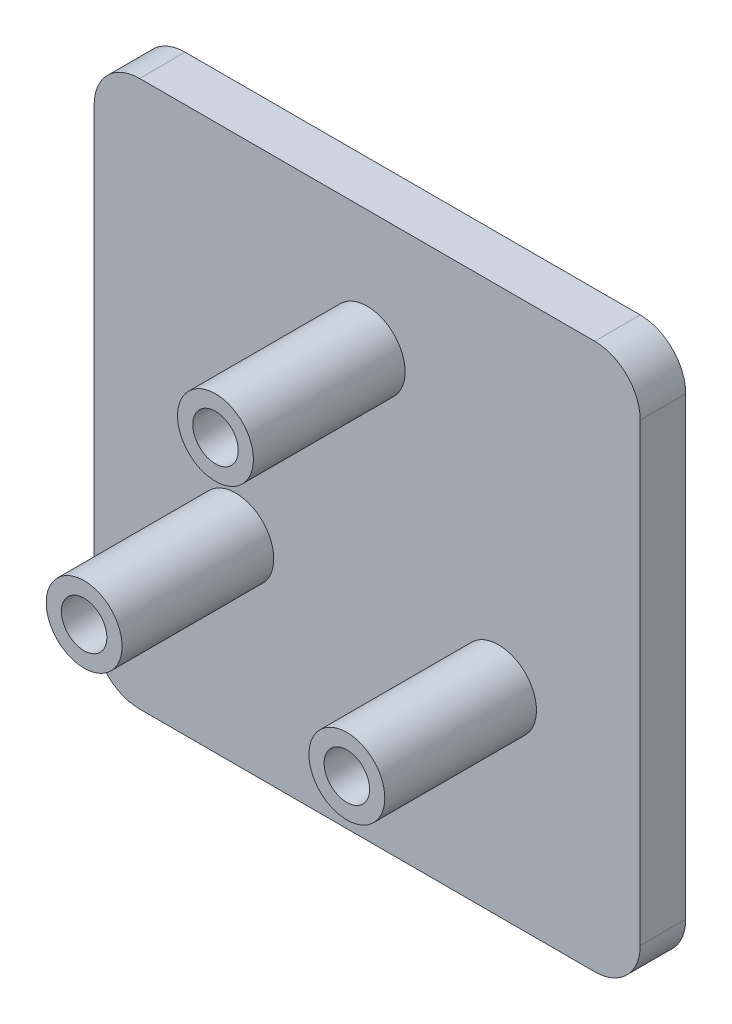
ISO-10303-21;
HEADER;
FILE_DESCRIPTION(('STEP AP214'),'2;1');
FILE_NAME('part.step','',(''),(''),'','','');
FILE_SCHEMA(('AUTOMOTIVE_DESIGN { 1 0 10303 214 1 1 1 1 }'));
ENDSEC;
DATA;
#1=APPLICATION_CONTEXT('core data for automotive mechanical design processes');
#2=APPLICATION_PROTOCOL_DEFINITION('international standard','automotive_design',2000,#1);
#3=PRODUCT_CONTEXT('',#1,'mechanical');
#4=PRODUCT('Part','Part','',(#3));
#5=PRODUCT_RELATED_PRODUCT_CATEGORY('part','',(#4));
#6=PRODUCT_DEFINITION_FORMATION('','',#4);
#7=PRODUCT_DEFINITION_CONTEXT('part definition',#1,'design');
#8=PRODUCT_DEFINITION('design','',#6,#7);
#9=PRODUCT_DEFINITION_SHAPE('','',#8);
#10=(LENGTH_UNIT() NAMED_UNIT(*) SI_UNIT(.MILLI.,.METRE.));
#11=(NAMED_UNIT(*) PLANE_ANGLE_UNIT() SI_UNIT($,.RADIAN.));
#12=(NAMED_UNIT(*) SI_UNIT($,.STERADIAN.) SOLID_ANGLE_UNIT());
#13=UNCERTAINTY_MEASURE_WITH_UNIT(LENGTH_MEASURE(1.E-05),#10,'distance_accuracy_value','');
#14=(GEOMETRIC_REPRESENTATION_CONTEXT(3) GLOBAL_UNCERTAINTY_ASSIGNED_CONTEXT((#13)) GLOBAL_UNIT_ASSIGNED_CONTEXT((#10,
#11,#12)) REPRESENTATION_CONTEXT('',''));
#15=CARTESIAN_POINT('',(0.,0.,0.));
#16=DIRECTION('',(0.,0.,1.));
#17=DIRECTION('',(1.,0.,0.));
#18=AXIS2_PLACEMENT_3D('',#15,#16,#17);
#19=CARTESIAN_POINT('',(-15.,15.,3.));
#20=DIRECTION('',(0.,0.,-1.));
#21=DIRECTION('',(-1.,0.,0.));
#22=AXIS2_PLACEMENT_3D('',#19,#20,#21);
#23=CYLINDRICAL_SURFACE('',#22,3.);
#24=CARTESIAN_POINT('',(-15.,15.,0.));
#25=DIRECTION('',(0.,0.,1.));
#26=DIRECTION('',(1.,0.,0.));
#27=AXIS2_PLACEMENT_3D('',#24,#25,#26);
#28=CIRCLE('',#27,3.);
#29=CARTESIAN_POINT('',(-18.,15.,0.));
#30=VERTEX_POINT('',#29);
#31=CARTESIAN_POINT('',(-15.,18.,0.));
#32=VERTEX_POINT('',#31);
#33=EDGE_CURVE('E154',#30,#32,#28,.F.);
#34=ORIENTED_EDGE('',*,*,#33,.F.);
#35=DIRECTION('',(0.,0.,-1.));
#36=VECTOR('',#35,1.);
#37=CARTESIAN_POINT('',(-18.,15.,3.));
#38=LINE('',#37,#36);
#39=CARTESIAN_POINT('',(-18.,15.,3.));
#40=VERTEX_POINT('',#39);
#41=EDGE_CURVE('E110',#40,#30,#38,.T.);
#42=ORIENTED_EDGE('',*,*,#41,.F.);
#43=CARTESIAN_POINT('',(-15.,15.,3.));
#44=DIRECTION('',(0.,0.,1.));
#45=DIRECTION('',(1.,0.,0.));
#46=AXIS2_PLACEMENT_3D('',#43,#44,#45);
#47=CIRCLE('',#46,3.);
#48=CARTESIAN_POINT('',(-15.,18.,3.));
#49=VERTEX_POINT('',#48);
#50=EDGE_CURVE('E173',#40,#49,#47,.F.);
#51=ORIENTED_EDGE('',*,*,#50,.T.);
#52=DIRECTION('',(0.,0.,-1.));
#53=VECTOR('',#52,1.);
#54=CARTESIAN_POINT('',(-15.,18.,3.));
#55=LINE('',#54,#53);
#56=EDGE_CURVE('E75',#49,#32,#55,.T.);
#57=ORIENTED_EDGE('',*,*,#56,.T.);
#58=EDGE_LOOP('',(#34,#42,#51,#57));
#59=FACE_BOUND('',#58,.T.);
#60=ADVANCED_FACE('F59',(#59),#23,.T.);
#61=CARTESIAN_POINT('',(-18.,0.,3.));
#62=DIRECTION('',(-1.,0.,0.));
#63=DIRECTION('',(0.,0.,1.));
#64=AXIS2_PLACEMENT_3D('',#61,#62,#63);
#65=PLANE('',#64);
#66=DIRECTION('',(0.,1.,0.));
#67=VECTOR('',#66,1.);
#68=CARTESIAN_POINT('',(-18.,0.,0.));
#69=LINE('',#68,#67);
#70=CARTESIAN_POINT('',(-18.,-15.,0.));
#71=VERTEX_POINT('',#70);
#72=EDGE_CURVE('E156',#71,#30,#69,.T.);
#73=ORIENTED_EDGE('',*,*,#72,.F.);
#74=DIRECTION('',(0.,0.,-1.));
#75=VECTOR('',#74,1.);
#76=CARTESIAN_POINT('',(-18.,-15.,3.));
#77=LINE('',#76,#75);
#78=CARTESIAN_POINT('',(-18.,-15.,3.));
#79=VERTEX_POINT('',#78);
#80=EDGE_CURVE('E182',#79,#71,#77,.T.);
#81=ORIENTED_EDGE('',*,*,#80,.F.);
#82=DIRECTION('',(0.,1.,0.));
#83=VECTOR('',#82,1.);
#84=CARTESIAN_POINT('',(-18.,0.,3.));
#85=LINE('',#84,#83);
#86=EDGE_CURVE('E231',#79,#40,#85,.T.);
#87=ORIENTED_EDGE('',*,*,#86,.T.);
#88=ORIENTED_EDGE('',*,*,#41,.T.);
#89=EDGE_LOOP('',(#73,#81,#87,#88));
#90=FACE_BOUND('',#89,.T.);
#91=ADVANCED_FACE('F218',(#90),#65,.T.);
#92=CARTESIAN_POINT('',(-15.,-15.,3.));
#93=DIRECTION('',(0.,0.,-1.));
#94=DIRECTION('',(-1.,0.,0.));
#95=AXIS2_PLACEMENT_3D('',#92,#93,#94);
#96=CYLINDRICAL_SURFACE('',#95,3.);
#97=CARTESIAN_POINT('',(-15.,-15.,0.));
#98=DIRECTION('',(0.,0.,1.));
#99=DIRECTION('',(1.,0.,0.));
#100=AXIS2_PLACEMENT_3D('',#97,#98,#99);
#101=CIRCLE('',#100,3.);
#102=CARTESIAN_POINT('',(-15.,-18.,0.));
#103=VERTEX_POINT('',#102);
#104=EDGE_CURVE('E160',#103,#71,#101,.F.);
#105=ORIENTED_EDGE('',*,*,#104,.F.);
#106=DIRECTION('',(0.,0.,-1.));
#107=VECTOR('',#106,1.);
#108=CARTESIAN_POINT('',(-15.,-18.,3.));
#109=LINE('',#108,#107);
#110=CARTESIAN_POINT('',(-15.,-18.,3.));
#111=VERTEX_POINT('',#110);
#112=EDGE_CURVE('E180',#111,#103,#109,.T.);
#113=ORIENTED_EDGE('',*,*,#112,.F.);
#114=CARTESIAN_POINT('',(-15.,-15.,3.));
#115=DIRECTION('',(0.,0.,1.));
#116=DIRECTION('',(1.,0.,0.));
#117=AXIS2_PLACEMENT_3D('',#114,#115,#116);
#118=CIRCLE('',#117,3.);
#119=EDGE_CURVE('E234',#111,#79,#118,.F.);
#120=ORIENTED_EDGE('',*,*,#119,.T.);
#121=ORIENTED_EDGE('',*,*,#80,.T.);
#122=EDGE_LOOP('',(#105,#113,#120,#121));
#123=FACE_BOUND('',#122,.T.);
#124=ADVANCED_FACE('F222',(#123),#96,.T.);
#125=CARTESIAN_POINT('',(0.,-18.,3.));
#126=DIRECTION('',(0.,1.,0.));
#127=DIRECTION('',(0.,0.,1.));
#128=AXIS2_PLACEMENT_3D('',#125,#126,#127);
#129=PLANE('',#128);
#130=DIRECTION('',(1.,0.,0.));
#131=VECTOR('',#130,1.);
#132=CARTESIAN_POINT('',(0.,-18.,0.));
#133=LINE('',#132,#131);
#134=CARTESIAN_POINT('',(15.,-18.,0.));
#135=VERTEX_POINT('',#134);
#136=EDGE_CURVE('E163',#103,#135,#133,.T.);
#137=ORIENTED_EDGE('',*,*,#136,.T.);
#138=DIRECTION('',(0.,0.,-1.));
#139=VECTOR('',#138,1.);
#140=CARTESIAN_POINT('',(15.,-18.,3.));
#141=LINE('',#140,#139);
#142=CARTESIAN_POINT('',(15.,-18.,3.));
#143=VERTEX_POINT('',#142);
#144=EDGE_CURVE('E177',#143,#135,#141,.T.);
#145=ORIENTED_EDGE('',*,*,#144,.F.);
#146=DIRECTION('',(1.,0.,0.));
#147=VECTOR('',#146,1.);
#148=CARTESIAN_POINT('',(0.,-18.,3.));
#149=LINE('',#148,#147);
#150=EDGE_CURVE('E236',#111,#143,#149,.T.);
#151=ORIENTED_EDGE('',*,*,#150,.F.);
#152=ORIENTED_EDGE('',*,*,#112,.T.);
#153=EDGE_LOOP('',(#137,#145,#151,#152));
#154=FACE_BOUND('',#153,.T.);
#155=ADVANCED_FACE('F244',(#154),#129,.F.);
#156=CARTESIAN_POINT('',(15.,-15.,3.));
#157=DIRECTION('',(0.,0.,-1.));
#158=DIRECTION('',(-1.,0.,0.));
#159=AXIS2_PLACEMENT_3D('',#156,#157,#158);
#160=CYLINDRICAL_SURFACE('',#159,3.);
#161=CARTESIAN_POINT('',(15.,-15.,0.));
#162=DIRECTION('',(0.,0.,1.));
#163=DIRECTION('',(1.,0.,0.));
#164=AXIS2_PLACEMENT_3D('',#161,#162,#163);
#165=CIRCLE('',#164,3.);
#166=CARTESIAN_POINT('',(18.,-15.,0.));
#167=VERTEX_POINT('',#166);
#168=EDGE_CURVE('E165',#135,#167,#165,.T.);
#169=ORIENTED_EDGE('',*,*,#168,.T.);
#170=DIRECTION('',(0.,0.,-1.));
#171=VECTOR('',#170,1.);
#172=CARTESIAN_POINT('',(18.,-15.,3.));
#173=LINE('',#172,#171);
#174=CARTESIAN_POINT('',(18.,-15.,3.));
#175=VERTEX_POINT('',#174);
#176=EDGE_CURVE('E146',#175,#167,#173,.T.);
#177=ORIENTED_EDGE('',*,*,#176,.F.);
#178=CARTESIAN_POINT('',(15.,-15.,3.));
#179=DIRECTION('',(0.,0.,1.));
#180=DIRECTION('',(1.,0.,0.));
#181=AXIS2_PLACEMENT_3D('',#178,#179,#180);
#182=CIRCLE('',#181,3.);
#183=EDGE_CURVE('E134',#143,#175,#182,.T.);
#184=ORIENTED_EDGE('',*,*,#183,.F.);
#185=ORIENTED_EDGE('',*,*,#144,.T.);
#186=EDGE_LOOP('',(#169,#177,#184,#185));
#187=FACE_BOUND('',#186,.T.);
#188=ADVANCED_FACE('F247',(#187),#160,.T.);
#189=CARTESIAN_POINT('',(18.,0.,3.));
#190=DIRECTION('',(-1.,0.,0.));
#191=DIRECTION('',(0.,0.,1.));
#192=AXIS2_PLACEMENT_3D('',#189,#190,#191);
#193=PLANE('',#192);
#194=DIRECTION('',(0.,1.,0.));
#195=VECTOR('',#194,1.);
#196=CARTESIAN_POINT('',(18.,0.,0.));
#197=LINE('',#196,#195);
#198=CARTESIAN_POINT('',(18.,15.,0.));
#199=VERTEX_POINT('',#198);
#200=EDGE_CURVE('E143',#167,#199,#197,.T.);
#201=ORIENTED_EDGE('',*,*,#200,.T.);
#202=DIRECTION('',(0.,0.,-1.));
#203=VECTOR('',#202,1.);
#204=CARTESIAN_POINT('',(18.,15.,3.));
#205=LINE('',#204,#203);
#206=CARTESIAN_POINT('',(18.,15.,3.));
#207=VERTEX_POINT('',#206);
#208=EDGE_CURVE('E140',#207,#199,#205,.T.);
#209=ORIENTED_EDGE('',*,*,#208,.F.);
#210=DIRECTION('',(0.,1.,0.));
#211=VECTOR('',#210,1.);
#212=CARTESIAN_POINT('',(18.,0.,3.));
#213=LINE('',#212,#211);
#214=EDGE_CURVE('E127',#175,#207,#213,.T.);
#215=ORIENTED_EDGE('',*,*,#214,.F.);
#216=ORIENTED_EDGE('',*,*,#176,.T.);
#217=EDGE_LOOP('',(#201,#209,#215,#216));
#218=FACE_BOUND('',#217,.T.);
#219=ADVANCED_FACE('F141',(#218),#193,.F.);
#220=CARTESIAN_POINT('',(15.,15.,3.));
#221=DIRECTION('',(0.,0.,-1.));
#222=DIRECTION('',(-1.,0.,0.));
#223=AXIS2_PLACEMENT_3D('',#220,#221,#222);
#224=CYLINDRICAL_SURFACE('',#223,3.);
#225=CARTESIAN_POINT('',(15.,15.,0.));
#226=DIRECTION('',(0.,0.,1.));
#227=DIRECTION('',(1.,0.,0.));
#228=AXIS2_PLACEMENT_3D('',#225,#226,#227);
#229=CIRCLE('',#228,3.);
#230=CARTESIAN_POINT('',(15.,18.,0.));
#231=VERTEX_POINT('',#230);
#232=EDGE_CURVE('E168',#231,#199,#229,.F.);
#233=ORIENTED_EDGE('',*,*,#232,.F.);
#234=DIRECTION('',(0.,0.,-1.));
#235=VECTOR('',#234,1.);
#236=CARTESIAN_POINT('',(15.,18.,3.));
#237=LINE('',#236,#235);
#238=CARTESIAN_POINT('',(15.,18.,3.));
#239=VERTEX_POINT('',#238);
#240=EDGE_CURVE('E101',#239,#231,#237,.T.);
#241=ORIENTED_EDGE('',*,*,#240,.F.);
#242=CARTESIAN_POINT('',(15.,15.,3.));
#243=DIRECTION('',(0.,0.,1.));
#244=DIRECTION('',(1.,0.,0.));
#245=AXIS2_PLACEMENT_3D('',#242,#243,#244);
#246=CIRCLE('',#245,3.);
#247=EDGE_CURVE('E132',#239,#207,#246,.F.);
#248=ORIENTED_EDGE('',*,*,#247,.T.);
#249=ORIENTED_EDGE('',*,*,#208,.T.);
#250=EDGE_LOOP('',(#233,#241,#248,#249));
#251=FACE_BOUND('',#250,.T.);
#252=ADVANCED_FACE('F148',(#251),#224,.T.);
#253=CARTESIAN_POINT('',(0.,18.,3.));
#254=DIRECTION('',(0.,1.,0.));
#255=DIRECTION('',(0.,0.,1.));
#256=AXIS2_PLACEMENT_3D('',#253,#254,#255);
#257=PLANE('',#256);
#258=DIRECTION('',(1.,0.,0.));
#259=VECTOR('',#258,1.);
#260=CARTESIAN_POINT('',(0.,18.,0.));
#261=LINE('',#260,#259);
#262=EDGE_CURVE('E170',#32,#231,#261,.T.);
#263=ORIENTED_EDGE('',*,*,#262,.F.);
#264=ORIENTED_EDGE('',*,*,#56,.F.);
#265=DIRECTION('',(1.,0.,0.));
#266=VECTOR('',#265,1.);
#267=CARTESIAN_POINT('',(0.,18.,3.));
#268=LINE('',#267,#266);
#269=EDGE_CURVE('E149',#49,#239,#268,.T.);
#270=ORIENTED_EDGE('',*,*,#269,.T.);
#271=ORIENTED_EDGE('',*,*,#240,.T.);
#272=EDGE_LOOP('',(#263,#264,#270,#271));
#273=FACE_BOUND('',#272,.T.);
#274=ADVANCED_FACE('F248',(#273),#257,.T.);
#275=CARTESIAN_POINT('',(0.,0.,3.));
#276=DIRECTION('',(0.,0.,1.));
#277=DIRECTION('',(1.,0.,0.));
#278=AXIS2_PLACEMENT_3D('',#275,#276,#277);
#279=PLANE('',#278);
#280=CARTESIAN_POINT('',(-8.66025403784443,-4.99999999999992,3.));
#281=DIRECTION('',(0.,0.,1.));
#282=DIRECTION('',(1.,0.,0.));
#283=AXIS2_PLACEMENT_3D('',#280,#281,#282);
#284=CIRCLE('',#283,2.5);
#285=CARTESIAN_POINT('',(-6.16025403784443,-4.99999999999992,3.));
#286=VERTEX_POINT('',#285);
#287=EDGE_CURVE('E408',#286,#286,#284,.T.);
#288=ORIENTED_EDGE('',*,*,#287,.F.);
#289=EDGE_LOOP('',(#288));
#290=FACE_BOUND('',#289,.T.);
#291=CARTESIAN_POINT('',(0.,10.,3.));
#292=DIRECTION('',(0.,0.,1.));
#293=DIRECTION('',(1.,0.,0.));
#294=AXIS2_PLACEMENT_3D('',#291,#292,#293);
#295=CIRCLE('',#294,2.5);
#296=CARTESIAN_POINT('',(2.5,10.,3.));
#297=VERTEX_POINT('',#296);
#298=EDGE_CURVE('E414',#297,#297,#295,.T.);
#299=ORIENTED_EDGE('',*,*,#298,.F.);
#300=EDGE_LOOP('',(#299));
#301=FACE_BOUND('',#300,.T.);
#302=CARTESIAN_POINT('',(8.66025403784437,-5.00000000000004,3.));
#303=DIRECTION('',(0.,0.,1.));
#304=DIRECTION('',(1.,0.,0.));
#305=AXIS2_PLACEMENT_3D('',#302,#303,#304);
#306=CIRCLE('',#305,2.5);
#307=CARTESIAN_POINT('',(11.1602540378444,-5.00000000000004,3.));
#308=VERTEX_POINT('',#307);
#309=EDGE_CURVE('E428',#308,#308,#306,.T.);
#310=ORIENTED_EDGE('',*,*,#309,.F.);
#311=EDGE_LOOP('',(#310));
#312=FACE_BOUND('',#311,.T.);
#313=ORIENTED_EDGE('',*,*,#50,.F.);
#314=ORIENTED_EDGE('',*,*,#86,.F.);
#315=ORIENTED_EDGE('',*,*,#119,.F.);
#316=ORIENTED_EDGE('',*,*,#150,.T.);
#317=ORIENTED_EDGE('',*,*,#183,.T.);
#318=ORIENTED_EDGE('',*,*,#214,.T.);
#319=ORIENTED_EDGE('',*,*,#247,.F.);
#320=ORIENTED_EDGE('',*,*,#269,.F.);
#321=EDGE_LOOP('',(#313,#314,#315,#316,#317,#318,#319,#320));
#322=FACE_BOUND('',#321,.T.);
#323=ADVANCED_FACE('F129',(#290,#301,#312,#322),#279,.T.);
#324=CARTESIAN_POINT('',(0.,0.,0.));
#325=DIRECTION('',(0.,0.,1.));
#326=DIRECTION('',(1.,0.,0.));
#327=AXIS2_PLACEMENT_3D('',#324,#325,#326);
#328=PLANE('',#327);
#329=ORIENTED_EDGE('',*,*,#33,.T.);
#330=ORIENTED_EDGE('',*,*,#262,.T.);
#331=ORIENTED_EDGE('',*,*,#232,.T.);
#332=ORIENTED_EDGE('',*,*,#200,.F.);
#333=ORIENTED_EDGE('',*,*,#168,.F.);
#334=ORIENTED_EDGE('',*,*,#136,.F.);
#335=ORIENTED_EDGE('',*,*,#104,.T.);
#336=ORIENTED_EDGE('',*,*,#72,.T.);
#337=EDGE_LOOP('',(#329,#330,#331,#332,#333,#334,#335,#336));
#338=FACE_BOUND('',#337,.T.);
#339=ADVANCED_FACE('F226',(#338),#328,.F.);
#340=CARTESIAN_POINT('',(8.66025403784437,-5.00000000000004,13.));
#341=DIRECTION('',(0.,0.,1.));
#342=DIRECTION('',(1.,0.,0.));
#343=AXIS2_PLACEMENT_3D('',#340,#341,#342);
#344=PLANE('',#343);
#345=CARTESIAN_POINT('',(8.66025403784437,-5.00000000000004,13.));
#346=DIRECTION('',(0.,0.,1.));
#347=DIRECTION('',(1.,0.,0.));
#348=AXIS2_PLACEMENT_3D('',#345,#346,#347);
#349=CIRCLE('',#348,2.5);
#350=CARTESIAN_POINT('',(11.1602540378444,-5.00000000000004,13.));
#351=VERTEX_POINT('',#350);
#352=EDGE_CURVE('E421',#351,#351,#349,.T.);
#353=ORIENTED_EDGE('',*,*,#352,.T.);
#354=EDGE_LOOP('',(#353));
#355=FACE_BOUND('',#354,.T.);
#356=CARTESIAN_POINT('',(8.66025403784437,-5.00000000000004,13.));
#357=DIRECTION('',(0.,0.,1.));
#358=DIRECTION('',(1.,0.,0.));
#359=AXIS2_PLACEMENT_3D('',#356,#357,#358);
#360=CIRCLE('',#359,1.5);
#361=CARTESIAN_POINT('',(10.1602540378444,-5.00000000000004,13.));
#362=VERTEX_POINT('',#361);
#363=EDGE_CURVE('E425',#362,#362,#360,.T.);
#364=ORIENTED_EDGE('',*,*,#363,.F.);
#365=EDGE_LOOP('',(#364));
#366=FACE_BOUND('',#365,.T.);
#367=ADVANCED_FACE('F311',(#355,#366),#344,.T.);
#368=CARTESIAN_POINT('',(8.66025403784437,-5.00000000000004,13.));
#369=DIRECTION('',(0.,0.,-1.));
#370=DIRECTION('',(-1.,0.,0.));
#371=AXIS2_PLACEMENT_3D('',#368,#369,#370);
#372=CYLINDRICAL_SURFACE('',#371,2.5);
#373=ORIENTED_EDGE('',*,*,#352,.F.);
#374=EDGE_LOOP('',(#373));
#375=FACE_BOUND('',#374,.T.);
#376=ORIENTED_EDGE('',*,*,#309,.T.);
#377=EDGE_LOOP('',(#376));
#378=FACE_BOUND('',#377,.T.);
#379=ADVANCED_FACE('F332',(#375,#378),#372,.T.);
#380=CARTESIAN_POINT('',(8.66025403784437,-5.00000000000004,13.));
#381=DIRECTION('',(0.,0.,-1.));
#382=DIRECTION('',(-1.,0.,0.));
#383=AXIS2_PLACEMENT_3D('',#380,#381,#382);
#384=CYLINDRICAL_SURFACE('',#383,1.5);
#385=ORIENTED_EDGE('',*,*,#363,.T.);
#386=EDGE_LOOP('',(#385));
#387=FACE_BOUND('',#386,.T.);
#388=CARTESIAN_POINT('',(8.66025403784437,-5.00000000000004,3.));
#389=DIRECTION('',(0.,0.,1.));
#390=DIRECTION('',(1.,0.,0.));
#391=AXIS2_PLACEMENT_3D('',#388,#389,#390);
#392=CIRCLE('',#391,1.5);
#393=CARTESIAN_POINT('',(10.1602540378444,-5.00000000000004,3.));
#394=VERTEX_POINT('',#393);
#395=EDGE_CURVE('E185',#394,#394,#392,.F.);
#396=ORIENTED_EDGE('',*,*,#395,.T.);
#397=EDGE_LOOP('',(#396));
#398=FACE_BOUND('',#397,.T.);
#399=ADVANCED_FACE('F212',(#387,#398),#384,.F.);
#400=ORIENTED_EDGE('',*,*,#395,.F.);
#401=EDGE_LOOP('',(#400));
#402=FACE_BOUND('',#401,.T.);
#403=ADVANCED_FACE('F196',(#402),#279,.T.);
#404=CARTESIAN_POINT('',(0.,10.,13.));
#405=DIRECTION('',(0.,0.,1.));
#406=DIRECTION('',(1.,0.,0.));
#407=AXIS2_PLACEMENT_3D('',#404,#405,#406);
#408=PLANE('',#407);
#409=CARTESIAN_POINT('',(0.,10.,13.));
#410=DIRECTION('',(0.,0.,1.));
#411=DIRECTION('',(1.,0.,0.));
#412=AXIS2_PLACEMENT_3D('',#409,#410,#411);
#413=CIRCLE('',#412,2.5);
#414=CARTESIAN_POINT('',(2.5,10.,13.));
#415=VERTEX_POINT('',#414);
#416=EDGE_CURVE('E409',#415,#415,#413,.T.);
#417=ORIENTED_EDGE('',*,*,#416,.T.);
#418=EDGE_LOOP('',(#417));
#419=FACE_BOUND('',#418,.T.);
#420=CARTESIAN_POINT('',(0.,10.,13.));
#421=DIRECTION('',(0.,0.,1.));
#422=DIRECTION('',(1.,0.,0.));
#423=AXIS2_PLACEMENT_3D('',#420,#421,#422);
#424=CIRCLE('',#423,1.5);
#425=CARTESIAN_POINT('',(1.5,10.,13.));
#426=VERTEX_POINT('',#425);
#427=EDGE_CURVE('E419',#426,#426,#424,.T.);
#428=ORIENTED_EDGE('',*,*,#427,.F.);
#429=EDGE_LOOP('',(#428));
#430=FACE_BOUND('',#429,.T.);
#431=ADVANCED_FACE('F211',(#419,#430),#408,.T.);
#432=CARTESIAN_POINT('',(0.,10.,13.));
#433=DIRECTION('',(0.,0.,-1.));
#434=DIRECTION('',(-1.,0.,0.));
#435=AXIS2_PLACEMENT_3D('',#432,#433,#434);
#436=CYLINDRICAL_SURFACE('',#435,2.5);
#437=ORIENTED_EDGE('',*,*,#416,.F.);
#438=EDGE_LOOP('',(#437));
#439=FACE_BOUND('',#438,.T.);
#440=ORIENTED_EDGE('',*,*,#298,.T.);
#441=EDGE_LOOP('',(#440));
#442=FACE_BOUND('',#441,.T.);
#443=ADVANCED_FACE('F205',(#439,#442),#436,.T.);
#444=CARTESIAN_POINT('',(0.,10.,13.));
#445=DIRECTION('',(0.,0.,-1.));
#446=DIRECTION('',(-1.,0.,0.));
#447=AXIS2_PLACEMENT_3D('',#444,#445,#446);
#448=CYLINDRICAL_SURFACE('',#447,1.5);
#449=ORIENTED_EDGE('',*,*,#427,.T.);
#450=EDGE_LOOP('',(#449));
#451=FACE_BOUND('',#450,.T.);
#452=CARTESIAN_POINT('',(0.,10.,3.));
#453=DIRECTION('',(0.,0.,1.));
#454=DIRECTION('',(1.,0.,0.));
#455=AXIS2_PLACEMENT_3D('',#452,#453,#454);
#456=CIRCLE('',#455,1.5);
#457=CARTESIAN_POINT('',(1.5,10.,3.));
#458=VERTEX_POINT('',#457);
#459=EDGE_CURVE('E67',#458,#458,#456,.F.);
#460=ORIENTED_EDGE('',*,*,#459,.T.);
#461=EDGE_LOOP('',(#460));
#462=FACE_BOUND('',#461,.T.);
#463=ADVANCED_FACE('F190',(#451,#462),#448,.F.);
#464=ORIENTED_EDGE('',*,*,#459,.F.);
#465=EDGE_LOOP('',(#464));
#466=FACE_BOUND('',#465,.T.);
#467=ADVANCED_FACE('F192',(#466),#279,.T.);
#468=CARTESIAN_POINT('',(-8.66025403784443,-4.99999999999992,13.));
#469=DIRECTION('',(0.,0.,1.));
#470=DIRECTION('',(1.,0.,0.));
#471=AXIS2_PLACEMENT_3D('',#468,#469,#470);
#472=PLANE('',#471);
#473=CARTESIAN_POINT('',(-8.66025403784443,-4.99999999999992,13.));
#474=DIRECTION('',(0.,0.,1.));
#475=DIRECTION('',(1.,0.,0.));
#476=AXIS2_PLACEMENT_3D('',#473,#474,#475);
#477=CIRCLE('',#476,2.5);
#478=CARTESIAN_POINT('',(-6.16025403784443,-4.99999999999992,13.));
#479=VERTEX_POINT('',#478);
#480=EDGE_CURVE('E157',#479,#479,#477,.T.);
#481=ORIENTED_EDGE('',*,*,#480,.T.);
#482=EDGE_LOOP('',(#481));
#483=FACE_BOUND('',#482,.T.);
#484=CARTESIAN_POINT('',(-8.66025403784443,-4.99999999999992,13.));
#485=DIRECTION('',(0.,0.,1.));
#486=DIRECTION('',(1.,0.,0.));
#487=AXIS2_PLACEMENT_3D('',#484,#485,#486);
#488=CIRCLE('',#487,1.5);
#489=CARTESIAN_POINT('',(-7.16025403784443,-4.99999999999992,13.));
#490=VERTEX_POINT('',#489);
#491=EDGE_CURVE('E405',#490,#490,#488,.T.);
#492=ORIENTED_EDGE('',*,*,#491,.F.);
#493=EDGE_LOOP('',(#492));
#494=FACE_BOUND('',#493,.T.);
#495=ADVANCED_FACE('F194',(#483,#494),#472,.T.);
#496=CARTESIAN_POINT('',(-8.66025403784443,-4.99999999999992,13.));
#497=DIRECTION('',(0.,0.,-1.));
#498=DIRECTION('',(-1.,0.,0.));
#499=AXIS2_PLACEMENT_3D('',#496,#497,#498);
#500=CYLINDRICAL_SURFACE('',#499,2.5);
#501=ORIENTED_EDGE('',*,*,#480,.F.);
#502=EDGE_LOOP('',(#501));
#503=FACE_BOUND('',#502,.T.);
#504=ORIENTED_EDGE('',*,*,#287,.T.);
#505=EDGE_LOOP('',(#504));
#506=FACE_BOUND('',#505,.T.);
#507=ADVANCED_FACE('F202',(#503,#506),#500,.T.);
#508=CARTESIAN_POINT('',(-8.66025403784443,-4.99999999999992,13.));
#509=DIRECTION('',(0.,0.,-1.));
#510=DIRECTION('',(-1.,0.,0.));
#511=AXIS2_PLACEMENT_3D('',#508,#509,#510);
#512=CYLINDRICAL_SURFACE('',#511,1.5);
#513=ORIENTED_EDGE('',*,*,#491,.T.);
#514=EDGE_LOOP('',(#513));
#515=FACE_BOUND('',#514,.T.);
#516=CARTESIAN_POINT('',(-8.66025403784443,-4.99999999999992,3.));
#517=DIRECTION('',(0.,0.,1.));
#518=DIRECTION('',(1.,0.,0.));
#519=AXIS2_PLACEMENT_3D('',#516,#517,#518);
#520=CIRCLE('',#519,1.5);
#521=CARTESIAN_POINT('',(-7.16025403784443,-4.99999999999992,3.));
#522=VERTEX_POINT('',#521);
#523=EDGE_CURVE('E12',#522,#522,#520,.F.);
#524=ORIENTED_EDGE('',*,*,#523,.T.);
#525=EDGE_LOOP('',(#524));
#526=FACE_BOUND('',#525,.T.);
#527=ADVANCED_FACE('F215',(#515,#526),#512,.F.);
#528=ORIENTED_EDGE('',*,*,#523,.F.);
#529=EDGE_LOOP('',(#528));
#530=FACE_BOUND('',#529,.T.);
#531=ADVANCED_FACE('F197',(#530),#279,.T.);
#532=CLOSED_SHELL('',(#60,#91,#124,#155,#188,#219,#252,#274,#323,#339,#367,#379,#399,#403,#431,
#443,#463,#467,#495,#507,#527,#531));
#533=MANIFOLD_SOLID_BREP('B2',#532);
#534=ADVANCED_BREP_SHAPE_REPRESENTATION('',(#18,#533),#14);
#535=SHAPE_DEFINITION_REPRESENTATION(#9,#534);
ENDSEC;
END-ISO-10303-21;
